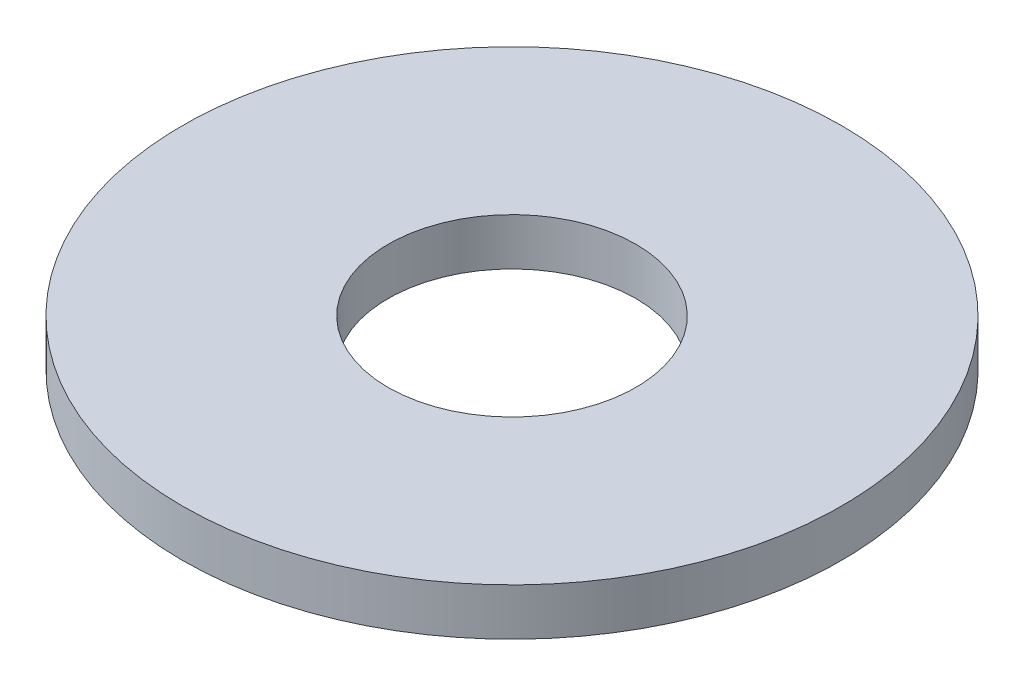
ISO-10303-21;
HEADER;
FILE_DESCRIPTION(('STEP AP214'),'2;1');
FILE_NAME('part.step','',(''),(''),'','','');
FILE_SCHEMA(('AUTOMOTIVE_DESIGN { 1 0 10303 214 1 1 1 1 }'));
ENDSEC;
DATA;
#1=APPLICATION_CONTEXT('core data for automotive mechanical design processes');
#2=APPLICATION_PROTOCOL_DEFINITION('international standard','automotive_design',2000,#1);
#3=PRODUCT_CONTEXT('',#1,'mechanical');
#4=PRODUCT('Part','Part','',(#3));
#5=PRODUCT_RELATED_PRODUCT_CATEGORY('part','',(#4));
#6=PRODUCT_DEFINITION_FORMATION('','',#4);
#7=PRODUCT_DEFINITION_CONTEXT('part definition',#1,'design');
#8=PRODUCT_DEFINITION('design','',#6,#7);
#9=PRODUCT_DEFINITION_SHAPE('','',#8);
#10=(LENGTH_UNIT() NAMED_UNIT(*) SI_UNIT(.MILLI.,.METRE.));
#11=(NAMED_UNIT(*) PLANE_ANGLE_UNIT() SI_UNIT($,.RADIAN.));
#12=(NAMED_UNIT(*) SI_UNIT($,.STERADIAN.) SOLID_ANGLE_UNIT());
#13=UNCERTAINTY_MEASURE_WITH_UNIT(LENGTH_MEASURE(1.E-05),#10,'distance_accuracy_value','');
#14=(GEOMETRIC_REPRESENTATION_CONTEXT(3) GLOBAL_UNCERTAINTY_ASSIGNED_CONTEXT((#13)) GLOBAL_UNIT_ASSIGNED_CONTEXT((#10,
#11,#12)) REPRESENTATION_CONTEXT('',''));
#15=CARTESIAN_POINT('',(0.,0.,0.));
#16=DIRECTION('',(0.,0.,1.));
#17=DIRECTION('',(1.,0.,0.));
#18=AXIS2_PLACEMENT_3D('',#15,#16,#17);
#19=CARTESIAN_POINT('',(0.,0.381,0.));
#20=DIRECTION('',(0.,1.,0.));
#21=DIRECTION('',(0.,0.,1.));
#22=AXIS2_PLACEMENT_3D('',#19,#20,#21);
#23=PLANE('',#22);
#24=CARTESIAN_POINT('',(0.,0.381,0.));
#25=DIRECTION('',(0.,1.,0.));
#26=DIRECTION('',(0.,0.,1.));
#27=AXIS2_PLACEMENT_3D('',#24,#25,#26);
#28=CIRCLE('',#27,2.667);
#29=CARTESIAN_POINT('',(0.,0.381,-2.667));
#30=VERTEX_POINT('',#29);
#31=EDGE_CURVE('E10',#30,#30,#28,.T.);
#32=ORIENTED_EDGE('',*,*,#31,.T.);
#33=EDGE_LOOP('',(#32));
#34=FACE_BOUND('',#33,.T.);
#35=CARTESIAN_POINT('',(0.,0.381,0.));
#36=DIRECTION('',(0.,1.,0.));
#37=DIRECTION('',(0.,0.,1.));
#38=AXIS2_PLACEMENT_3D('',#35,#36,#37);
#39=CIRCLE('',#38,1.0033);
#40=CARTESIAN_POINT('',(0.,0.381,-1.0033));
#41=VERTEX_POINT('',#40);
#42=EDGE_CURVE('E41',#41,#41,#39,.T.);
#43=ORIENTED_EDGE('',*,*,#42,.F.);
#44=EDGE_LOOP('',(#43));
#45=FACE_BOUND('',#44,.T.);
#46=ADVANCED_FACE('F30',(#34,#45),#23,.T.);
#47=CARTESIAN_POINT('',(0.,0.,0.));
#48=DIRECTION('',(0.,1.,0.));
#49=DIRECTION('',(0.,0.,1.));
#50=AXIS2_PLACEMENT_3D('',#47,#48,#49);
#51=PLANE('',#50);
#52=CARTESIAN_POINT('',(0.,0.,0.));
#53=DIRECTION('',(0.,1.,0.));
#54=DIRECTION('',(0.,0.,1.));
#55=AXIS2_PLACEMENT_3D('',#52,#53,#54);
#56=CIRCLE('',#55,2.667);
#57=CARTESIAN_POINT('',(0.,0.,-2.667));
#58=VERTEX_POINT('',#57);
#59=EDGE_CURVE('E34',#58,#58,#56,.T.);
#60=ORIENTED_EDGE('',*,*,#59,.F.);
#61=EDGE_LOOP('',(#60));
#62=FACE_BOUND('',#61,.T.);
#63=CARTESIAN_POINT('',(0.,0.,0.));
#64=DIRECTION('',(0.,1.,0.));
#65=DIRECTION('',(0.,0.,1.));
#66=AXIS2_PLACEMENT_3D('',#63,#64,#65);
#67=CIRCLE('',#66,1.0033);
#68=CARTESIAN_POINT('',(0.,0.,-1.0033));
#69=VERTEX_POINT('',#68);
#70=EDGE_CURVE('E43',#69,#69,#67,.T.);
#71=ORIENTED_EDGE('',*,*,#70,.T.);
#72=EDGE_LOOP('',(#71));
#73=FACE_BOUND('',#72,.T.);
#74=ADVANCED_FACE('F53',(#62,#73),#51,.F.);
#75=CARTESIAN_POINT('',(0.,0.381,0.));
#76=DIRECTION('',(0.,-1.,0.));
#77=DIRECTION('',(0.,0.,-1.));
#78=AXIS2_PLACEMENT_3D('',#75,#76,#77);
#79=CYLINDRICAL_SURFACE('',#78,2.667);
#80=CARTESIAN_POINT('',(0.,0.381,-2.667));
#81=CARTESIAN_POINT('',(0.,0.37703125,-2.667));
#82=CARTESIAN_POINT('',(0.,0.3730625,-2.667));
#83=CARTESIAN_POINT('',(0.,0.365125,-2.667));
#84=CARTESIAN_POINT('',(0.,0.36115625,-2.667));
#85=CARTESIAN_POINT('',(0.,0.35321875,-2.667));
#86=CARTESIAN_POINT('',(0.,0.34925,-2.667));
#87=CARTESIAN_POINT('',(0.,0.3413125,-2.667));
#88=CARTESIAN_POINT('',(0.,0.33734375,-2.667));
#89=CARTESIAN_POINT('',(0.,0.32940625,-2.667));
#90=CARTESIAN_POINT('',(0.,0.3254375,-2.667));
#91=CARTESIAN_POINT('',(0.,0.3175,-2.667));
#92=CARTESIAN_POINT('',(0.,0.31353125,-2.667));
#93=CARTESIAN_POINT('',(0.,0.30559375,-2.667));
#94=CARTESIAN_POINT('',(0.,0.301625,-2.667));
#95=CARTESIAN_POINT('',(0.,0.2936875,-2.667));
#96=CARTESIAN_POINT('',(0.,0.28971875,-2.667));
#97=CARTESIAN_POINT('',(0.,0.28178125,-2.667));
#98=CARTESIAN_POINT('',(0.,0.2778125,-2.667));
#99=CARTESIAN_POINT('',(0.,0.269875,-2.667));
#100=CARTESIAN_POINT('',(0.,0.26590625,-2.667));
#101=CARTESIAN_POINT('',(0.,0.25796875,-2.667));
#102=CARTESIAN_POINT('',(0.,0.254,-2.667));
#103=CARTESIAN_POINT('',(0.,0.2460625,-2.667));
#104=CARTESIAN_POINT('',(0.,0.24209375,-2.667));
#105=CARTESIAN_POINT('',(0.,0.23415625,-2.667));
#106=CARTESIAN_POINT('',(0.,0.2301875,-2.667));
#107=CARTESIAN_POINT('',(0.,0.22225,-2.667));
#108=CARTESIAN_POINT('',(0.,0.21828125,-2.667));
#109=CARTESIAN_POINT('',(0.,0.21034375,-2.667));
#110=CARTESIAN_POINT('',(0.,0.206375,-2.667));
#111=CARTESIAN_POINT('',(0.,0.1984375,-2.667));
#112=CARTESIAN_POINT('',(0.,0.19446875,-2.667));
#113=CARTESIAN_POINT('',(0.,0.18653125,-2.667));
#114=CARTESIAN_POINT('',(0.,0.1825625,-2.667));
#115=CARTESIAN_POINT('',(0.,0.174625,-2.667));
#116=CARTESIAN_POINT('',(0.,0.17065625,-2.667));
#117=CARTESIAN_POINT('',(0.,0.16271875,-2.667));
#118=CARTESIAN_POINT('',(0.,0.15875,-2.667));
#119=CARTESIAN_POINT('',(0.,0.1508125,-2.667));
#120=CARTESIAN_POINT('',(0.,0.14684375,-2.667));
#121=CARTESIAN_POINT('',(0.,0.13890625,-2.667));
#122=CARTESIAN_POINT('',(0.,0.1349375,-2.667));
#123=CARTESIAN_POINT('',(0.,0.127,-2.667));
#124=CARTESIAN_POINT('',(0.,0.12303125,-2.667));
#125=CARTESIAN_POINT('',(0.,0.11509375,-2.667));
#126=CARTESIAN_POINT('',(0.,0.111125,-2.667));
#127=CARTESIAN_POINT('',(0.,0.1031875,-2.667));
#128=CARTESIAN_POINT('',(0.,0.09921875,-2.667));
#129=CARTESIAN_POINT('',(0.,0.09128125,-2.667));
#130=CARTESIAN_POINT('',(0.,0.0873125,-2.667));
#131=CARTESIAN_POINT('',(0.,0.079375,-2.667));
#132=CARTESIAN_POINT('',(0.,0.07540625,-2.667));
#133=CARTESIAN_POINT('',(0.,0.06746875,-2.667));
#134=CARTESIAN_POINT('',(0.,0.0635,-2.667));
#135=CARTESIAN_POINT('',(0.,0.0555625,-2.667));
#136=CARTESIAN_POINT('',(0.,0.05159375,-2.667));
#137=CARTESIAN_POINT('',(0.,0.04365625,-2.667));
#138=CARTESIAN_POINT('',(0.,0.0396875,-2.667));
#139=CARTESIAN_POINT('',(0.,0.03175,-2.667));
#140=CARTESIAN_POINT('',(0.,0.02778125,-2.667));
#141=CARTESIAN_POINT('',(0.,0.01984375,-2.667));
#142=CARTESIAN_POINT('',(0.,0.015875,-2.667));
#143=CARTESIAN_POINT('',(0.,0.00793749999999999,-2.667));
#144=CARTESIAN_POINT('',(0.,0.00396874999999999,-2.667));
#145=CARTESIAN_POINT('',(0.,0.,-2.667));
#146=B_SPLINE_CURVE_WITH_KNOTS('',3,(#80,#81,#82,#83,#84,#85,#86,#87,#88,#89,#90,#91,#92,#93,
#94,#95,#96,#97,#98,#99,#100,#101,#102,#103,#104,#105,#106,#107,#108,#109,#110,#111,#112,#113,
#114,#115,#116,#117,#118,#119,#120,#121,#122,#123,#124,#125,#126,#127,#128,#129,#130,#131,#132,
#133,#134,#135,#136,#137,#138,#139,#140,#141,#142,#143,#144,#145),.UNSPECIFIED.,.F.,.F.,(4,2,2,
2,2,2,2,2,2,2,2,2,2,2,2,2,2,2,2,2,2,2,2,2,2,2,2,2,2,2,2,2,4),(0.,0.01190625,0.0238125,
0.0357187499999999,0.047625,0.05953125,0.0714374999999999,0.08334375,0.09525,0.10715625,
0.1190625,0.13096875,0.142875,0.15478125,0.1666875,0.17859375,0.1905,0.20240625,0.2143125,
0.22621875,0.238125,0.25003125,0.2619375,0.27384375,0.28575,0.29765625,0.3095625,0.32146875,
0.333375,0.34528125,0.3571875,0.36909375,0.381),.UNSPECIFIED.);
#147=EDGE_CURVE('BSEAM32',#30,#58,#146,.T.);
#148=ORIENTED_EDGE('',*,*,#31,.F.);
#149=ORIENTED_EDGE('',*,*,#59,.T.);
#150=ORIENTED_EDGE('',*,*,#147,.T.);
#151=ORIENTED_EDGE('',*,*,#147,.F.);
#152=EDGE_LOOP('',(#148,#150,#149,#151));
#153=FACE_BOUND('',#152,.T.);
#154=ADVANCED_FACE('F32',(#153),#79,.T.);
#155=CARTESIAN_POINT('',(0.,0.381,0.));
#156=DIRECTION('',(0.,-1.,0.));
#157=DIRECTION('',(0.,0.,-1.));
#158=AXIS2_PLACEMENT_3D('',#155,#156,#157);
#159=CYLINDRICAL_SURFACE('',#158,1.0033);
#160=CARTESIAN_POINT('',(0.,0.381,-1.0033));
#161=CARTESIAN_POINT('',(0.,0.37703125,-1.0033));
#162=CARTESIAN_POINT('',(0.,0.3730625,-1.0033));
#163=CARTESIAN_POINT('',(0.,0.365125,-1.0033));
#164=CARTESIAN_POINT('',(0.,0.36115625,-1.0033));
#165=CARTESIAN_POINT('',(0.,0.35321875,-1.0033));
#166=CARTESIAN_POINT('',(0.,0.34925,-1.0033));
#167=CARTESIAN_POINT('',(0.,0.3413125,-1.0033));
#168=CARTESIAN_POINT('',(0.,0.33734375,-1.0033));
#169=CARTESIAN_POINT('',(0.,0.32940625,-1.0033));
#170=CARTESIAN_POINT('',(0.,0.3254375,-1.0033));
#171=CARTESIAN_POINT('',(0.,0.3175,-1.0033));
#172=CARTESIAN_POINT('',(0.,0.31353125,-1.0033));
#173=CARTESIAN_POINT('',(0.,0.30559375,-1.0033));
#174=CARTESIAN_POINT('',(0.,0.301625,-1.0033));
#175=CARTESIAN_POINT('',(0.,0.2936875,-1.0033));
#176=CARTESIAN_POINT('',(0.,0.28971875,-1.0033));
#177=CARTESIAN_POINT('',(0.,0.28178125,-1.0033));
#178=CARTESIAN_POINT('',(0.,0.2778125,-1.0033));
#179=CARTESIAN_POINT('',(0.,0.269875,-1.0033));
#180=CARTESIAN_POINT('',(0.,0.26590625,-1.0033));
#181=CARTESIAN_POINT('',(0.,0.25796875,-1.0033));
#182=CARTESIAN_POINT('',(0.,0.254,-1.0033));
#183=CARTESIAN_POINT('',(0.,0.2460625,-1.0033));
#184=CARTESIAN_POINT('',(0.,0.24209375,-1.0033));
#185=CARTESIAN_POINT('',(0.,0.23415625,-1.0033));
#186=CARTESIAN_POINT('',(0.,0.2301875,-1.0033));
#187=CARTESIAN_POINT('',(0.,0.22225,-1.0033));
#188=CARTESIAN_POINT('',(0.,0.21828125,-1.0033));
#189=CARTESIAN_POINT('',(0.,0.21034375,-1.0033));
#190=CARTESIAN_POINT('',(0.,0.206375,-1.0033));
#191=CARTESIAN_POINT('',(0.,0.1984375,-1.0033));
#192=CARTESIAN_POINT('',(0.,0.19446875,-1.0033));
#193=CARTESIAN_POINT('',(0.,0.18653125,-1.0033));
#194=CARTESIAN_POINT('',(0.,0.1825625,-1.0033));
#195=CARTESIAN_POINT('',(0.,0.174625,-1.0033));
#196=CARTESIAN_POINT('',(0.,0.17065625,-1.0033));
#197=CARTESIAN_POINT('',(0.,0.16271875,-1.0033));
#198=CARTESIAN_POINT('',(0.,0.15875,-1.0033));
#199=CARTESIAN_POINT('',(0.,0.1508125,-1.0033));
#200=CARTESIAN_POINT('',(0.,0.14684375,-1.0033));
#201=CARTESIAN_POINT('',(0.,0.13890625,-1.0033));
#202=CARTESIAN_POINT('',(0.,0.1349375,-1.0033));
#203=CARTESIAN_POINT('',(0.,0.127,-1.0033));
#204=CARTESIAN_POINT('',(0.,0.12303125,-1.0033));
#205=CARTESIAN_POINT('',(0.,0.11509375,-1.0033));
#206=CARTESIAN_POINT('',(0.,0.111125,-1.0033));
#207=CARTESIAN_POINT('',(0.,0.1031875,-1.0033));
#208=CARTESIAN_POINT('',(0.,0.09921875,-1.0033));
#209=CARTESIAN_POINT('',(0.,0.09128125,-1.0033));
#210=CARTESIAN_POINT('',(0.,0.0873125,-1.0033));
#211=CARTESIAN_POINT('',(0.,0.079375,-1.0033));
#212=CARTESIAN_POINT('',(0.,0.07540625,-1.0033));
#213=CARTESIAN_POINT('',(0.,0.06746875,-1.0033));
#214=CARTESIAN_POINT('',(0.,0.0635,-1.0033));
#215=CARTESIAN_POINT('',(0.,0.0555625,-1.0033));
#216=CARTESIAN_POINT('',(0.,0.05159375,-1.0033));
#217=CARTESIAN_POINT('',(0.,0.04365625,-1.0033));
#218=CARTESIAN_POINT('',(0.,0.0396875,-1.0033));
#219=CARTESIAN_POINT('',(0.,0.03175,-1.0033));
#220=CARTESIAN_POINT('',(0.,0.02778125,-1.0033));
#221=CARTESIAN_POINT('',(0.,0.01984375,-1.0033));
#222=CARTESIAN_POINT('',(0.,0.015875,-1.0033));
#223=CARTESIAN_POINT('',(0.,0.00793749999999999,-1.0033));
#224=CARTESIAN_POINT('',(0.,0.00396874999999999,-1.0033));
#225=CARTESIAN_POINT('',(0.,0.,-1.0033));
#226=B_SPLINE_CURVE_WITH_KNOTS('',3,(#160,#161,#162,#163,#164,#165,#166,#167,#168,#169,#170,
#171,#172,#173,#174,#175,#176,#177,#178,#179,#180,#181,#182,#183,#184,#185,#186,#187,#188,#189,
#190,#191,#192,#193,#194,#195,#196,#197,#198,#199,#200,#201,#202,#203,#204,#205,#206,#207,#208,
#209,#210,#211,#212,#213,#214,#215,#216,#217,#218,#219,#220,#221,#222,#223,#224,#225),
.UNSPECIFIED.,.F.,.F.,(4,2,2,2,2,2,2,2,2,2,2,2,2,2,2,2,2,2,2,2,2,2,2,2,2,2,2,2,2,2,2,2,4),(0.,
0.01190625,0.0238125,0.0357187499999999,0.047625,0.05953125,0.0714374999999999,0.08334375,
0.09525,0.10715625,0.1190625,0.13096875,0.142875,0.15478125,0.1666875,0.17859375,0.1905,
0.20240625,0.2143125,0.22621875,0.238125,0.25003125,0.2619375,0.27384375,0.28575,0.29765625,
0.3095625,0.32146875,0.333375,0.34528125,0.3571875,0.36909375,0.381),.UNSPECIFIED.);
#227=EDGE_CURVE('BSEAM49',#41,#69,#226,.T.);
#228=ORIENTED_EDGE('',*,*,#42,.T.);
#229=ORIENTED_EDGE('',*,*,#70,.F.);
#230=ORIENTED_EDGE('',*,*,#227,.T.);
#231=ORIENTED_EDGE('',*,*,#227,.F.);
#232=EDGE_LOOP('',(#228,#230,#229,#231));
#233=FACE_BOUND('',#232,.T.);
#234=ADVANCED_FACE('F49',(#233),#159,.F.);
#235=CLOSED_SHELL('',(#46,#74,#154,#234));
#236=MANIFOLD_SOLID_BREP('B2',#235);
#237=ADVANCED_BREP_SHAPE_REPRESENTATION('',(#18,#236),#14);
#238=SHAPE_DEFINITION_REPRESENTATION(#9,#237);
ENDSEC;
END-ISO-10303-21;
